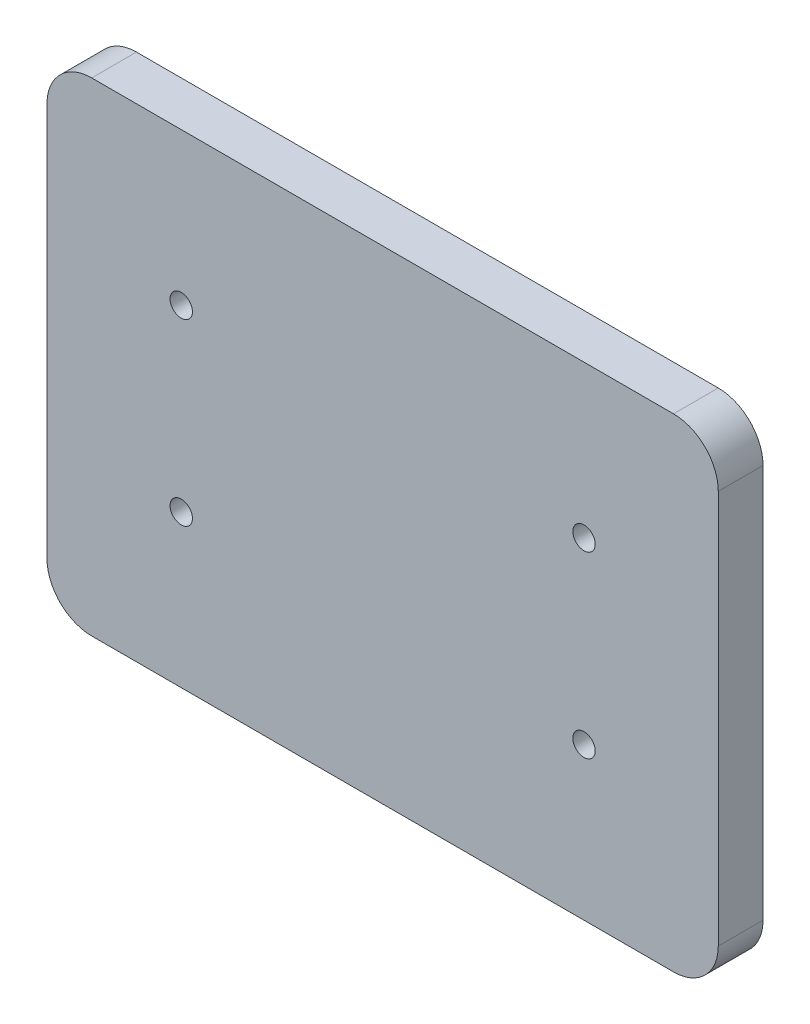
ISO-10303-21;
HEADER;
FILE_DESCRIPTION(('STEP AP214'),'2;1');
FILE_NAME('part.step','',(''),(''),'','','');
FILE_SCHEMA(('AUTOMOTIVE_DESIGN { 1 0 10303 214 1 1 1 1 }'));
ENDSEC;
DATA;
#1=APPLICATION_CONTEXT('core data for automotive mechanical design processes');
#2=APPLICATION_PROTOCOL_DEFINITION('international standard','automotive_design',2000,#1);
#3=PRODUCT_CONTEXT('',#1,'mechanical');
#4=PRODUCT('Part','Part','',(#3));
#5=PRODUCT_RELATED_PRODUCT_CATEGORY('part','',(#4));
#6=PRODUCT_DEFINITION_FORMATION('','',#4);
#7=PRODUCT_DEFINITION_CONTEXT('part definition',#1,'design');
#8=PRODUCT_DEFINITION('design','',#6,#7);
#9=PRODUCT_DEFINITION_SHAPE('','',#8);
#10=(LENGTH_UNIT() NAMED_UNIT(*) SI_UNIT(.MILLI.,.METRE.));
#11=(NAMED_UNIT(*) PLANE_ANGLE_UNIT() SI_UNIT($,.RADIAN.));
#12=(NAMED_UNIT(*) SI_UNIT($,.STERADIAN.) SOLID_ANGLE_UNIT());
#13=UNCERTAINTY_MEASURE_WITH_UNIT(LENGTH_MEASURE(1.E-05),#10,'distance_accuracy_value','');
#14=(GEOMETRIC_REPRESENTATION_CONTEXT(3) GLOBAL_UNCERTAINTY_ASSIGNED_CONTEXT((#13)) GLOBAL_UNIT_ASSIGNED_CONTEXT((#10,
#11,#12)) REPRESENTATION_CONTEXT('',''));
#15=CARTESIAN_POINT('',(0.,0.,0.));
#16=DIRECTION('',(0.,0.,1.));
#17=DIRECTION('',(1.,0.,0.));
#18=AXIS2_PLACEMENT_3D('',#15,#16,#17);
#19=CARTESIAN_POINT('',(0.,0.,10.));
#20=DIRECTION('',(0.,0.,-1.));
#21=DIRECTION('',(-1.,0.,0.));
#22=AXIS2_PLACEMENT_3D('',#19,#20,#21);
#23=PLANE('',#22);
#24=CARTESIAN_POINT('',(-44.9978936332638,20.,10.));
#25=DIRECTION('',(0.,0.,1.));
#26=DIRECTION('',(1.,0.,0.));
#27=AXIS2_PLACEMENT_3D('',#24,#25,#26);
#28=CIRCLE('',#27,2.5);
#29=CARTESIAN_POINT('',(-42.4978936332638,20.,10.));
#30=VERTEX_POINT('',#29);
#31=EDGE_CURVE('E159',#30,#30,#28,.T.);
#32=ORIENTED_EDGE('',*,*,#31,.F.);
#33=EDGE_LOOP('',(#32));
#34=FACE_BOUND('',#33,.T.);
#35=CARTESIAN_POINT('',(-44.9978936332638,-20.,10.));
#36=DIRECTION('',(0.,0.,1.));
#37=DIRECTION('',(1.,0.,0.));
#38=AXIS2_PLACEMENT_3D('',#35,#36,#37);
#39=CIRCLE('',#38,2.5);
#40=CARTESIAN_POINT('',(-42.4978936332638,-20.,10.));
#41=VERTEX_POINT('',#40);
#42=EDGE_CURVE('E228',#41,#41,#39,.T.);
#43=ORIENTED_EDGE('',*,*,#42,.F.);
#44=EDGE_LOOP('',(#43));
#45=FACE_BOUND('',#44,.T.);
#46=DIRECTION('',(0.,1.,0.));
#47=VECTOR('',#46,1.);
#48=CARTESIAN_POINT('',(75.,-54.,10.));
#49=LINE('',#48,#47);
#50=CARTESIAN_POINT('',(75.,-44.,10.));
#51=VERTEX_POINT('',#50);
#52=CARTESIAN_POINT('',(75.,44.,10.));
#53=VERTEX_POINT('',#52);
#54=EDGE_CURVE('E154',#51,#53,#49,.T.);
#55=ORIENTED_EDGE('',*,*,#54,.T.);
#56=CARTESIAN_POINT('',(65.,44.,10.));
#57=DIRECTION('',(0.,0.,-1.));
#58=DIRECTION('',(-1.,0.,0.));
#59=AXIS2_PLACEMENT_3D('',#56,#57,#58);
#60=CIRCLE('',#59,10.);
#61=CARTESIAN_POINT('',(65.,54.,10.));
#62=VERTEX_POINT('',#61);
#63=EDGE_CURVE('E188',#53,#62,#60,.F.);
#64=ORIENTED_EDGE('',*,*,#63,.T.);
#65=DIRECTION('',(-1.,0.,0.));
#66=VECTOR('',#65,1.);
#67=CARTESIAN_POINT('',(-75.,54.,10.));
#68=LINE('',#67,#66);
#69=CARTESIAN_POINT('',(-65.,54.,10.));
#70=VERTEX_POINT('',#69);
#71=EDGE_CURVE('E131',#62,#70,#68,.T.);
#72=ORIENTED_EDGE('',*,*,#71,.T.);
#73=CARTESIAN_POINT('',(-65.,44.,10.));
#74=DIRECTION('',(0.,0.,-1.));
#75=DIRECTION('',(-1.,0.,0.));
#76=AXIS2_PLACEMENT_3D('',#73,#74,#75);
#77=CIRCLE('',#76,10.);
#78=CARTESIAN_POINT('',(-75.,44.,10.));
#79=VERTEX_POINT('',#78);
#80=EDGE_CURVE('E182',#70,#79,#77,.F.);
#81=ORIENTED_EDGE('',*,*,#80,.T.);
#82=DIRECTION('',(0.,-1.,0.));
#83=VECTOR('',#82,1.);
#84=CARTESIAN_POINT('',(-75.,-54.,10.));
#85=LINE('',#84,#83);
#86=CARTESIAN_POINT('',(-75.,-44.,10.));
#87=VERTEX_POINT('',#86);
#88=EDGE_CURVE('E201',#79,#87,#85,.T.);
#89=ORIENTED_EDGE('',*,*,#88,.T.);
#90=CARTESIAN_POINT('',(-65.,-44.,10.));
#91=DIRECTION('',(0.,0.,-1.));
#92=DIRECTION('',(-1.,0.,0.));
#93=AXIS2_PLACEMENT_3D('',#90,#91,#92);
#94=CIRCLE('',#93,10.);
#95=CARTESIAN_POINT('',(-65.,-54.,10.));
#96=VERTEX_POINT('',#95);
#97=EDGE_CURVE('E65',#87,#96,#94,.F.);
#98=ORIENTED_EDGE('',*,*,#97,.T.);
#99=DIRECTION('',(1.,0.,0.));
#100=VECTOR('',#99,1.);
#101=CARTESIAN_POINT('',(-75.,-54.,10.));
#102=LINE('',#101,#100);
#103=CARTESIAN_POINT('',(65.,-54.,10.));
#104=VERTEX_POINT('',#103);
#105=EDGE_CURVE('E167',#96,#104,#102,.T.);
#106=ORIENTED_EDGE('',*,*,#105,.T.);
#107=CARTESIAN_POINT('',(65.,-44.,10.));
#108=DIRECTION('',(0.,0.,-1.));
#109=DIRECTION('',(-1.,0.,0.));
#110=AXIS2_PLACEMENT_3D('',#107,#108,#109);
#111=CIRCLE('',#110,10.);
#112=EDGE_CURVE('E185',#104,#51,#111,.F.);
#113=ORIENTED_EDGE('',*,*,#112,.T.);
#114=EDGE_LOOP('',(#55,#64,#72,#81,#89,#98,#106,#113));
#115=FACE_BOUND('',#114,.T.);
#116=CARTESIAN_POINT('',(44.9978936332638,-20.,10.));
#117=DIRECTION('',(0.,0.,1.));
#118=DIRECTION('',(1.,0.,0.));
#119=AXIS2_PLACEMENT_3D('',#116,#117,#118);
#120=CIRCLE('',#119,2.5);
#121=CARTESIAN_POINT('',(47.4978936332638,-20.,10.));
#122=VERTEX_POINT('',#121);
#123=EDGE_CURVE('E160',#122,#122,#120,.T.);
#124=ORIENTED_EDGE('',*,*,#123,.F.);
#125=EDGE_LOOP('',(#124));
#126=FACE_BOUND('',#125,.T.);
#127=CARTESIAN_POINT('',(44.9978936332638,20.,10.));
#128=DIRECTION('',(0.,0.,1.));
#129=DIRECTION('',(1.,0.,0.));
#130=AXIS2_PLACEMENT_3D('',#127,#128,#129);
#131=CIRCLE('',#130,2.5);
#132=CARTESIAN_POINT('',(47.4978936332638,20.,10.));
#133=VERTEX_POINT('',#132);
#134=EDGE_CURVE('E165',#133,#133,#131,.T.);
#135=ORIENTED_EDGE('',*,*,#134,.F.);
#136=EDGE_LOOP('',(#135));
#137=FACE_BOUND('',#136,.T.);
#138=ADVANCED_FACE('F42',(#34,#45,#115,#126,#137),#23,.F.);
#139=CARTESIAN_POINT('',(75.,-54.,10.));
#140=DIRECTION('',(-1.,0.,0.));
#141=DIRECTION('',(0.,0.,1.));
#142=AXIS2_PLACEMENT_3D('',#139,#140,#141);
#143=PLANE('',#142);
#144=DIRECTION('',(0.,1.,0.));
#145=VECTOR('',#144,1.);
#146=CARTESIAN_POINT('',(75.,-54.,0.));
#147=LINE('',#146,#145);
#148=CARTESIAN_POINT('',(75.,-44.,0.));
#149=VERTEX_POINT('',#148);
#150=CARTESIAN_POINT('',(75.,44.,0.));
#151=VERTEX_POINT('',#150);
#152=EDGE_CURVE('E141',#149,#151,#147,.T.);
#153=ORIENTED_EDGE('',*,*,#152,.T.);
#154=DIRECTION('',(0.,0.,-1.));
#155=VECTOR('',#154,1.);
#156=CARTESIAN_POINT('',(75.,44.,10.));
#157=LINE('',#156,#155);
#158=EDGE_CURVE('E115',#151,#53,#157,.F.);
#159=ORIENTED_EDGE('',*,*,#158,.T.);
#160=ORIENTED_EDGE('',*,*,#54,.F.);
#161=DIRECTION('',(0.,0.,-1.));
#162=VECTOR('',#161,1.);
#163=CARTESIAN_POINT('',(75.,-44.,10.));
#164=LINE('',#163,#162);
#165=EDGE_CURVE('E121',#51,#149,#164,.T.);
#166=ORIENTED_EDGE('',*,*,#165,.T.);
#167=EDGE_LOOP('',(#153,#159,#160,#166));
#168=FACE_BOUND('',#167,.T.);
#169=ADVANCED_FACE('F218',(#168),#143,.F.);
#170=CARTESIAN_POINT('',(-75.,54.,10.));
#171=DIRECTION('',(0.,-1.,0.));
#172=DIRECTION('',(0.,0.,-1.));
#173=AXIS2_PLACEMENT_3D('',#170,#171,#172);
#174=PLANE('',#173);
#175=ORIENTED_EDGE('',*,*,#71,.F.);
#176=DIRECTION('',(0.,0.,-1.));
#177=VECTOR('',#176,1.);
#178=CARTESIAN_POINT('',(65.,54.,10.));
#179=LINE('',#178,#177);
#180=CARTESIAN_POINT('',(65.,54.,0.));
#181=VERTEX_POINT('',#180);
#182=EDGE_CURVE('E114',#62,#181,#179,.T.);
#183=ORIENTED_EDGE('',*,*,#182,.T.);
#184=DIRECTION('',(-1.,0.,0.));
#185=VECTOR('',#184,1.);
#186=CARTESIAN_POINT('',(-75.,54.,0.));
#187=LINE('',#186,#185);
#188=CARTESIAN_POINT('',(-65.,54.,0.));
#189=VERTEX_POINT('',#188);
#190=EDGE_CURVE('E128',#181,#189,#187,.T.);
#191=ORIENTED_EDGE('',*,*,#190,.T.);
#192=DIRECTION('',(0.,0.,-1.));
#193=VECTOR('',#192,1.);
#194=CARTESIAN_POINT('',(-65.,54.,10.));
#195=LINE('',#194,#193);
#196=EDGE_CURVE('E134',#189,#70,#195,.F.);
#197=ORIENTED_EDGE('',*,*,#196,.T.);
#198=EDGE_LOOP('',(#175,#183,#191,#197));
#199=FACE_BOUND('',#198,.T.);
#200=ADVANCED_FACE('F127',(#199),#174,.F.);
#201=CARTESIAN_POINT('',(-75.,-54.,10.));
#202=DIRECTION('',(1.,0.,0.));
#203=DIRECTION('',(0.,0.,-1.));
#204=AXIS2_PLACEMENT_3D('',#201,#202,#203);
#205=PLANE('',#204);
#206=ORIENTED_EDGE('',*,*,#88,.F.);
#207=DIRECTION('',(0.,0.,-1.));
#208=VECTOR('',#207,1.);
#209=CARTESIAN_POINT('',(-75.,44.,10.));
#210=LINE('',#209,#208);
#211=CARTESIAN_POINT('',(-75.,44.,0.));
#212=VERTEX_POINT('',#211);
#213=EDGE_CURVE('E11',#79,#212,#210,.T.);
#214=ORIENTED_EDGE('',*,*,#213,.T.);
#215=DIRECTION('',(0.,-1.,0.));
#216=VECTOR('',#215,1.);
#217=CARTESIAN_POINT('',(-75.,-54.,0.));
#218=LINE('',#217,#216);
#219=CARTESIAN_POINT('',(-75.,-44.,0.));
#220=VERTEX_POINT('',#219);
#221=EDGE_CURVE('E140',#212,#220,#218,.T.);
#222=ORIENTED_EDGE('',*,*,#221,.T.);
#223=DIRECTION('',(0.,0.,-1.));
#224=VECTOR('',#223,1.);
#225=CARTESIAN_POINT('',(-75.,-44.,10.));
#226=LINE('',#225,#224);
#227=EDGE_CURVE('E51',#220,#87,#226,.F.);
#228=ORIENTED_EDGE('',*,*,#227,.T.);
#229=EDGE_LOOP('',(#206,#214,#222,#228));
#230=FACE_BOUND('',#229,.T.);
#231=ADVANCED_FACE('F200',(#230),#205,.F.);
#232=CARTESIAN_POINT('',(-75.,-54.,10.));
#233=DIRECTION('',(0.,1.,0.));
#234=DIRECTION('',(0.,0.,1.));
#235=AXIS2_PLACEMENT_3D('',#232,#233,#234);
#236=PLANE('',#235);
#237=DIRECTION('',(1.,0.,0.));
#238=VECTOR('',#237,1.);
#239=CARTESIAN_POINT('',(-75.,-54.,0.));
#240=LINE('',#239,#238);
#241=CARTESIAN_POINT('',(-65.,-54.,0.));
#242=VERTEX_POINT('',#241);
#243=CARTESIAN_POINT('',(65.,-54.,0.));
#244=VERTEX_POINT('',#243);
#245=EDGE_CURVE('E146',#242,#244,#240,.T.);
#246=ORIENTED_EDGE('',*,*,#245,.T.);
#247=DIRECTION('',(0.,0.,-1.));
#248=VECTOR('',#247,1.);
#249=CARTESIAN_POINT('',(65.,-54.,10.));
#250=LINE('',#249,#248);
#251=EDGE_CURVE('E58',#244,#104,#250,.F.);
#252=ORIENTED_EDGE('',*,*,#251,.T.);
#253=ORIENTED_EDGE('',*,*,#105,.F.);
#254=DIRECTION('',(0.,0.,-1.));
#255=VECTOR('',#254,1.);
#256=CARTESIAN_POINT('',(-65.,-54.,10.));
#257=LINE('',#256,#255);
#258=EDGE_CURVE('E191',#96,#242,#257,.T.);
#259=ORIENTED_EDGE('',*,*,#258,.T.);
#260=EDGE_LOOP('',(#246,#252,#253,#259));
#261=FACE_BOUND('',#260,.T.);
#262=ADVANCED_FACE('F211',(#261),#236,.F.);
#263=CARTESIAN_POINT('',(0.,0.,0.));
#264=DIRECTION('',(0.,0.,-1.));
#265=DIRECTION('',(-1.,0.,0.));
#266=AXIS2_PLACEMENT_3D('',#263,#264,#265);
#267=PLANE('',#266);
#268=CARTESIAN_POINT('',(44.9978936332638,20.,0.));
#269=DIRECTION('',(0.,0.,-1.));
#270=DIRECTION('',(-1.,0.,0.));
#271=AXIS2_PLACEMENT_3D('',#268,#269,#270);
#272=CIRCLE('',#271,2.5);
#273=CARTESIAN_POINT('',(42.4978936332638,20.,0.));
#274=VERTEX_POINT('',#273);
#275=EDGE_CURVE('E161',#274,#274,#272,.T.);
#276=ORIENTED_EDGE('',*,*,#275,.F.);
#277=EDGE_LOOP('',(#276));
#278=FACE_BOUND('',#277,.T.);
#279=CARTESIAN_POINT('',(44.9978936332638,-20.,0.));
#280=DIRECTION('',(0.,0.,-1.));
#281=DIRECTION('',(-1.,0.,0.));
#282=AXIS2_PLACEMENT_3D('',#279,#280,#281);
#283=CIRCLE('',#282,2.5);
#284=CARTESIAN_POINT('',(42.4978936332638,-20.,0.));
#285=VERTEX_POINT('',#284);
#286=EDGE_CURVE('E155',#285,#285,#283,.T.);
#287=ORIENTED_EDGE('',*,*,#286,.F.);
#288=EDGE_LOOP('',(#287));
#289=FACE_BOUND('',#288,.T.);
#290=CARTESIAN_POINT('',(-44.9978936332638,20.,0.));
#291=DIRECTION('',(0.,0.,-1.));
#292=DIRECTION('',(-1.,0.,0.));
#293=AXIS2_PLACEMENT_3D('',#290,#291,#292);
#294=CIRCLE('',#293,2.5);
#295=CARTESIAN_POINT('',(-47.4978936332638,20.,0.));
#296=VERTEX_POINT('',#295);
#297=EDGE_CURVE('E232',#296,#296,#294,.T.);
#298=ORIENTED_EDGE('',*,*,#297,.F.);
#299=EDGE_LOOP('',(#298));
#300=FACE_BOUND('',#299,.T.);
#301=CARTESIAN_POINT('',(-44.9978936332638,-20.,0.));
#302=DIRECTION('',(0.,0.,-1.));
#303=DIRECTION('',(-1.,0.,0.));
#304=AXIS2_PLACEMENT_3D('',#301,#302,#303);
#305=CIRCLE('',#304,2.5);
#306=CARTESIAN_POINT('',(-47.4978936332638,-20.,0.));
#307=VERTEX_POINT('',#306);
#308=EDGE_CURVE('E148',#307,#307,#305,.T.);
#309=ORIENTED_EDGE('',*,*,#308,.F.);
#310=EDGE_LOOP('',(#309));
#311=FACE_BOUND('',#310,.T.);
#312=ORIENTED_EDGE('',*,*,#190,.F.);
#313=CARTESIAN_POINT('',(65.,44.,0.));
#314=DIRECTION('',(0.,0.,-1.));
#315=DIRECTION('',(-1.,0.,0.));
#316=AXIS2_PLACEMENT_3D('',#313,#314,#315);
#317=CIRCLE('',#316,10.);
#318=EDGE_CURVE('E110',#181,#151,#317,.T.);
#319=ORIENTED_EDGE('',*,*,#318,.T.);
#320=ORIENTED_EDGE('',*,*,#152,.F.);
#321=CARTESIAN_POINT('',(65.,-44.,0.));
#322=DIRECTION('',(0.,0.,-1.));
#323=DIRECTION('',(-1.,0.,0.));
#324=AXIS2_PLACEMENT_3D('',#321,#322,#323);
#325=CIRCLE('',#324,10.);
#326=EDGE_CURVE('E122',#149,#244,#325,.T.);
#327=ORIENTED_EDGE('',*,*,#326,.T.);
#328=ORIENTED_EDGE('',*,*,#245,.F.);
#329=CARTESIAN_POINT('',(-65.,-44.,0.));
#330=DIRECTION('',(0.,0.,-1.));
#331=DIRECTION('',(-1.,0.,0.));
#332=AXIS2_PLACEMENT_3D('',#329,#330,#331);
#333=CIRCLE('',#332,10.);
#334=EDGE_CURVE('E133',#242,#220,#333,.T.);
#335=ORIENTED_EDGE('',*,*,#334,.T.);
#336=ORIENTED_EDGE('',*,*,#221,.F.);
#337=CARTESIAN_POINT('',(-65.,44.,0.));
#338=DIRECTION('',(0.,0.,-1.));
#339=DIRECTION('',(-1.,0.,0.));
#340=AXIS2_PLACEMENT_3D('',#337,#338,#339);
#341=CIRCLE('',#340,10.);
#342=EDGE_CURVE('E138',#212,#189,#341,.T.);
#343=ORIENTED_EDGE('',*,*,#342,.T.);
#344=EDGE_LOOP('',(#312,#319,#320,#327,#328,#335,#336,#343));
#345=FACE_BOUND('',#344,.T.);
#346=ADVANCED_FACE('F136',(#278,#289,#300,#311,#345),#267,.T.);
#347=CARTESIAN_POINT('',(-44.9978936332638,-20.,10.));
#348=DIRECTION('',(0.,0.,1.));
#349=DIRECTION('',(1.,0.,0.));
#350=AXIS2_PLACEMENT_3D('',#347,#348,#349);
#351=CYLINDRICAL_SURFACE('',#350,2.5);
#352=ORIENTED_EDGE('',*,*,#308,.T.);
#353=EDGE_LOOP('',(#352));
#354=FACE_BOUND('',#353,.T.);
#355=ORIENTED_EDGE('',*,*,#42,.T.);
#356=EDGE_LOOP('',(#355));
#357=FACE_BOUND('',#356,.T.);
#358=ADVANCED_FACE('F259',(#354,#357),#351,.F.);
#359=CARTESIAN_POINT('',(-44.9978936332638,20.,10.));
#360=DIRECTION('',(0.,0.,1.));
#361=DIRECTION('',(1.,0.,0.));
#362=AXIS2_PLACEMENT_3D('',#359,#360,#361);
#363=CYLINDRICAL_SURFACE('',#362,2.5);
#364=ORIENTED_EDGE('',*,*,#297,.T.);
#365=EDGE_LOOP('',(#364));
#366=FACE_BOUND('',#365,.T.);
#367=ORIENTED_EDGE('',*,*,#31,.T.);
#368=EDGE_LOOP('',(#367));
#369=FACE_BOUND('',#368,.T.);
#370=ADVANCED_FACE('F355',(#366,#369),#363,.F.);
#371=CARTESIAN_POINT('',(44.9978936332638,-20.,10.));
#372=DIRECTION('',(0.,0.,1.));
#373=DIRECTION('',(1.,0.,0.));
#374=AXIS2_PLACEMENT_3D('',#371,#372,#373);
#375=CYLINDRICAL_SURFACE('',#374,2.5);
#376=ORIENTED_EDGE('',*,*,#286,.T.);
#377=EDGE_LOOP('',(#376));
#378=FACE_BOUND('',#377,.T.);
#379=ORIENTED_EDGE('',*,*,#123,.T.);
#380=EDGE_LOOP('',(#379));
#381=FACE_BOUND('',#380,.T.);
#382=ADVANCED_FACE('F344',(#378,#381),#375,.F.);
#383=CARTESIAN_POINT('',(44.9978936332638,20.,10.));
#384=DIRECTION('',(0.,0.,1.));
#385=DIRECTION('',(1.,0.,0.));
#386=AXIS2_PLACEMENT_3D('',#383,#384,#385);
#387=CYLINDRICAL_SURFACE('',#386,2.5);
#388=ORIENTED_EDGE('',*,*,#275,.T.);
#389=EDGE_LOOP('',(#388));
#390=FACE_BOUND('',#389,.T.);
#391=ORIENTED_EDGE('',*,*,#134,.T.);
#392=EDGE_LOOP('',(#391));
#393=FACE_BOUND('',#392,.T.);
#394=ADVANCED_FACE('F246',(#390,#393),#387,.F.);
#395=CARTESIAN_POINT('',(65.,44.,10.));
#396=DIRECTION('',(0.,0.,-1.));
#397=DIRECTION('',(-1.,0.,0.));
#398=AXIS2_PLACEMENT_3D('',#395,#396,#397);
#399=CYLINDRICAL_SURFACE('',#398,10.);
#400=ORIENTED_EDGE('',*,*,#63,.F.);
#401=ORIENTED_EDGE('',*,*,#158,.F.);
#402=ORIENTED_EDGE('',*,*,#318,.F.);
#403=ORIENTED_EDGE('',*,*,#182,.F.);
#404=EDGE_LOOP('',(#400,#401,#402,#403));
#405=FACE_BOUND('',#404,.T.);
#406=ADVANCED_FACE('F113',(#405),#399,.T.);
#407=CARTESIAN_POINT('',(65.,-44.,10.));
#408=DIRECTION('',(0.,0.,-1.));
#409=DIRECTION('',(-1.,0.,0.));
#410=AXIS2_PLACEMENT_3D('',#407,#408,#409);
#411=CYLINDRICAL_SURFACE('',#410,10.);
#412=ORIENTED_EDGE('',*,*,#112,.F.);
#413=ORIENTED_EDGE('',*,*,#251,.F.);
#414=ORIENTED_EDGE('',*,*,#326,.F.);
#415=ORIENTED_EDGE('',*,*,#165,.F.);
#416=EDGE_LOOP('',(#412,#413,#414,#415));
#417=FACE_BOUND('',#416,.T.);
#418=ADVANCED_FACE('F215',(#417),#411,.T.);
#419=CARTESIAN_POINT('',(-65.,44.,10.));
#420=DIRECTION('',(0.,0.,-1.));
#421=DIRECTION('',(-1.,0.,0.));
#422=AXIS2_PLACEMENT_3D('',#419,#420,#421);
#423=CYLINDRICAL_SURFACE('',#422,10.);
#424=ORIENTED_EDGE('',*,*,#80,.F.);
#425=ORIENTED_EDGE('',*,*,#196,.F.);
#426=ORIENTED_EDGE('',*,*,#342,.F.);
#427=ORIENTED_EDGE('',*,*,#213,.F.);
#428=EDGE_LOOP('',(#424,#425,#426,#427));
#429=FACE_BOUND('',#428,.T.);
#430=ADVANCED_FACE('F273',(#429),#423,.T.);
#431=CARTESIAN_POINT('',(-65.,-44.,10.));
#432=DIRECTION('',(0.,0.,-1.));
#433=DIRECTION('',(-1.,0.,0.));
#434=AXIS2_PLACEMENT_3D('',#431,#432,#433);
#435=CYLINDRICAL_SURFACE('',#434,10.);
#436=ORIENTED_EDGE('',*,*,#97,.F.);
#437=ORIENTED_EDGE('',*,*,#227,.F.);
#438=ORIENTED_EDGE('',*,*,#334,.F.);
#439=ORIENTED_EDGE('',*,*,#258,.F.);
#440=EDGE_LOOP('',(#436,#437,#438,#439));
#441=FACE_BOUND('',#440,.T.);
#442=ADVANCED_FACE('F44',(#441),#435,.T.);
#443=CLOSED_SHELL('',(#138,#169,#200,#231,#262,#346,#358,#370,#382,#394,#406,#418,#430,#442));
#444=MANIFOLD_SOLID_BREP('B2',#443);
#445=ADVANCED_BREP_SHAPE_REPRESENTATION('',(#18,#444),#14);
#446=SHAPE_DEFINITION_REPRESENTATION(#9,#445);
ENDSEC;
END-ISO-10303-21;
